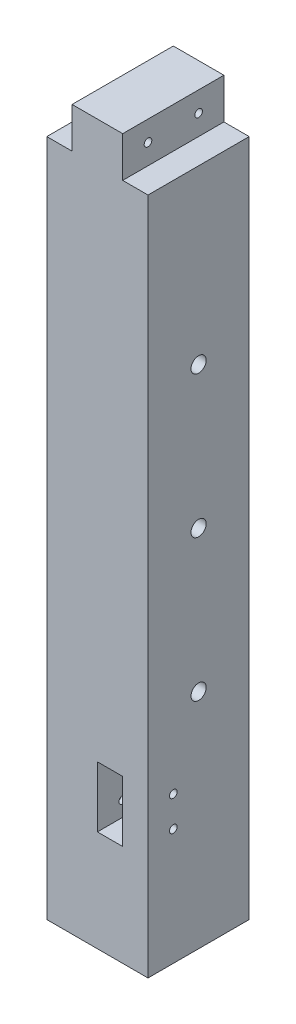
ISO-10303-21;
HEADER;
FILE_DESCRIPTION(('STEP AP214'),'2;1');
FILE_NAME('part.step','',(''),(''),'','','');
FILE_SCHEMA(('AUTOMOTIVE_DESIGN { 1 0 10303 214 1 1 1 1 }'));
ENDSEC;
DATA;
#1=APPLICATION_CONTEXT('core data for automotive mechanical design processes');
#2=APPLICATION_PROTOCOL_DEFINITION('international standard','automotive_design',2000,#1);
#3=PRODUCT_CONTEXT('',#1,'mechanical');
#4=PRODUCT('Part','Part','',(#3));
#5=PRODUCT_RELATED_PRODUCT_CATEGORY('part','',(#4));
#6=PRODUCT_DEFINITION_FORMATION('','',#4);
#7=PRODUCT_DEFINITION_CONTEXT('part definition',#1,'design');
#8=PRODUCT_DEFINITION('design','',#6,#7);
#9=PRODUCT_DEFINITION_SHAPE('','',#8);
#10=(LENGTH_UNIT() NAMED_UNIT(*) SI_UNIT(.MILLI.,.METRE.));
#11=(NAMED_UNIT(*) PLANE_ANGLE_UNIT() SI_UNIT($,.RADIAN.));
#12=(NAMED_UNIT(*) SI_UNIT($,.STERADIAN.) SOLID_ANGLE_UNIT());
#13=UNCERTAINTY_MEASURE_WITH_UNIT(LENGTH_MEASURE(1.E-05),#10,'distance_accuracy_value','');
#14=(GEOMETRIC_REPRESENTATION_CONTEXT(3) GLOBAL_UNCERTAINTY_ASSIGNED_CONTEXT((#13)) GLOBAL_UNIT_ASSIGNED_CONTEXT((#10,
#11,#12)) REPRESENTATION_CONTEXT('',''));
#15=CARTESIAN_POINT('',(0.,0.,0.));
#16=DIRECTION('',(0.,0.,1.));
#17=DIRECTION('',(1.,0.,0.));
#18=AXIS2_PLACEMENT_3D('',#15,#16,#17);
#19=CARTESIAN_POINT('',(-1.85962356624714E-13,425.45,127.));
#20=DIRECTION('',(0.,-1.,0.));
#21=DIRECTION('',(1.,0.,0.));
#22=AXIS2_PLACEMENT_3D('',#19,#20,#21);
#23=PLANE('',#22);
#24=DIRECTION('',(-1.,0.,0.));
#25=VECTOR('',#24,1.);
#26=CARTESIAN_POINT('',(-1.85962356624714E-13,425.45,0.));
#27=LINE('',#26,#25);
#28=CARTESIAN_POINT('',(63.5,425.45,0.));
#29=VERTEX_POINT('',#28);
#30=CARTESIAN_POINT('',(31.75,425.45,0.));
#31=VERTEX_POINT('',#30);
#32=EDGE_CURVE('E216',#29,#31,#27,.T.);
#33=ORIENTED_EDGE('',*,*,#32,.T.);
#34=DIRECTION('',(0.,0.,-1.));
#35=VECTOR('',#34,1.);
#36=CARTESIAN_POINT('',(31.75,425.45,127.));
#37=LINE('',#36,#35);
#38=CARTESIAN_POINT('',(31.75,425.45,127.));
#39=VERTEX_POINT('',#38);
#40=EDGE_CURVE('E11',#39,#31,#37,.T.);
#41=ORIENTED_EDGE('',*,*,#40,.F.);
#42=DIRECTION('',(-1.,0.,0.));
#43=VECTOR('',#42,1.);
#44=CARTESIAN_POINT('',(-1.85962356624714E-13,425.45,127.));
#45=LINE('',#44,#43);
#46=CARTESIAN_POINT('',(63.5,425.45,127.));
#47=VERTEX_POINT('',#46);
#48=EDGE_CURVE('E222',#47,#39,#45,.T.);
#49=ORIENTED_EDGE('',*,*,#48,.F.);
#50=DIRECTION('',(0.,0.,-1.));
#51=VECTOR('',#50,1.);
#52=CARTESIAN_POINT('',(63.5,425.45,127.));
#53=LINE('',#52,#51);
#54=EDGE_CURVE('E241',#47,#29,#53,.T.);
#55=ORIENTED_EDGE('',*,*,#54,.T.);
#56=EDGE_LOOP('',(#33,#41,#49,#55));
#57=FACE_BOUND('',#56,.T.);
#58=ADVANCED_FACE('F35',(#57),#23,.F.);
#59=CARTESIAN_POINT('',(31.7500000000001,0.,127.));
#60=DIRECTION('',(1.,0.,0.));
#61=DIRECTION('',(0.,1.,0.));
#62=AXIS2_PLACEMENT_3D('',#59,#60,#61);
#63=PLANE('',#62);
#64=CARTESIAN_POINT('',(31.75,450.85,31.75));
#65=DIRECTION('',(1.,0.,0.));
#66=DIRECTION('',(0.,1.,0.));
#67=AXIS2_PLACEMENT_3D('',#64,#65,#66);
#68=CIRCLE('',#67,4.7625);
#69=CARTESIAN_POINT('',(31.75,455.6125,31.75));
#70=VERTEX_POINT('',#69);
#71=EDGE_CURVE('E307',#70,#70,#68,.T.);
#72=ORIENTED_EDGE('',*,*,#71,.F.);
#73=EDGE_LOOP('',(#72));
#74=FACE_BOUND('',#73,.T.);
#75=CARTESIAN_POINT('',(31.75,450.85,95.25));
#76=DIRECTION('',(1.,0.,0.));
#77=DIRECTION('',(0.,1.,0.));
#78=AXIS2_PLACEMENT_3D('',#75,#76,#77);
#79=CIRCLE('',#78,4.7625);
#80=CARTESIAN_POINT('',(31.75,455.6125,95.25));
#81=VERTEX_POINT('',#80);
#82=EDGE_CURVE('E297',#81,#81,#79,.T.);
#83=ORIENTED_EDGE('',*,*,#82,.F.);
#84=EDGE_LOOP('',(#83));
#85=FACE_BOUND('',#84,.T.);
#86=DIRECTION('',(0.,-1.,0.));
#87=VECTOR('',#86,1.);
#88=CARTESIAN_POINT('',(31.7500000000001,0.,0.));
#89=LINE('',#88,#87);
#90=CARTESIAN_POINT('',(31.75,476.25,0.));
#91=VERTEX_POINT('',#90);
#92=EDGE_CURVE('E244',#91,#31,#89,.T.);
#93=ORIENTED_EDGE('',*,*,#92,.F.);
#94=DIRECTION('',(0.,0.,-1.));
#95=VECTOR('',#94,1.);
#96=CARTESIAN_POINT('',(31.75,476.25,127.));
#97=LINE('',#96,#95);
#98=CARTESIAN_POINT('',(31.75,476.25,127.));
#99=VERTEX_POINT('',#98);
#100=EDGE_CURVE('E44',#99,#91,#97,.T.);
#101=ORIENTED_EDGE('',*,*,#100,.F.);
#102=DIRECTION('',(0.,-1.,0.));
#103=VECTOR('',#102,1.);
#104=CARTESIAN_POINT('',(31.7500000000001,0.,127.));
#105=LINE('',#104,#103);
#106=EDGE_CURVE('E224',#99,#39,#105,.T.);
#107=ORIENTED_EDGE('',*,*,#106,.T.);
#108=ORIENTED_EDGE('',*,*,#40,.T.);
#109=EDGE_LOOP('',(#93,#101,#107,#108));
#110=FACE_BOUND('',#109,.T.);
#111=ADVANCED_FACE('F37',(#74,#85,#110),#63,.T.);
#112=CARTESIAN_POINT('',(0.,476.25,127.));
#113=DIRECTION('',(0.,-1.,0.));
#114=DIRECTION('',(0.,0.,-1.));
#115=AXIS2_PLACEMENT_3D('',#112,#113,#114);
#116=PLANE('',#115);
#117=DIRECTION('',(-1.,0.,0.));
#118=VECTOR('',#117,1.);
#119=CARTESIAN_POINT('',(0.,476.25,0.));
#120=LINE('',#119,#118);
#121=CARTESIAN_POINT('',(-31.75,476.25,0.));
#122=VERTEX_POINT('',#121);
#123=EDGE_CURVE('E248',#91,#122,#120,.T.);
#124=ORIENTED_EDGE('',*,*,#123,.T.);
#125=DIRECTION('',(0.,0.,-1.));
#126=VECTOR('',#125,1.);
#127=CARTESIAN_POINT('',(-31.75,476.25,127.));
#128=LINE('',#127,#126);
#129=CARTESIAN_POINT('',(-31.75,476.25,127.));
#130=VERTEX_POINT('',#129);
#131=EDGE_CURVE('E271',#130,#122,#128,.T.);
#132=ORIENTED_EDGE('',*,*,#131,.F.);
#133=DIRECTION('',(-1.,0.,0.));
#134=VECTOR('',#133,1.);
#135=CARTESIAN_POINT('',(0.,476.25,127.));
#136=LINE('',#135,#134);
#137=EDGE_CURVE('E229',#99,#130,#136,.T.);
#138=ORIENTED_EDGE('',*,*,#137,.F.);
#139=ORIENTED_EDGE('',*,*,#100,.T.);
#140=EDGE_LOOP('',(#124,#132,#138,#139));
#141=FACE_BOUND('',#140,.T.);
#142=ADVANCED_FACE('F390',(#141),#116,.F.);
#143=CARTESIAN_POINT('',(-31.7499999999999,0.,127.));
#144=DIRECTION('',(1.,0.,0.));
#145=DIRECTION('',(0.,1.,0.));
#146=AXIS2_PLACEMENT_3D('',#143,#144,#145);
#147=PLANE('',#146);
#148=CARTESIAN_POINT('',(-31.75,450.85,31.75));
#149=DIRECTION('',(1.,0.,0.));
#150=DIRECTION('',(0.,1.,0.));
#151=AXIS2_PLACEMENT_3D('',#148,#149,#150);
#152=CIRCLE('',#151,4.7625);
#153=CARTESIAN_POINT('',(-31.75,455.6125,31.75));
#154=VERTEX_POINT('',#153);
#155=EDGE_CURVE('E39',#154,#154,#152,.T.);
#156=ORIENTED_EDGE('',*,*,#155,.T.);
#157=EDGE_LOOP('',(#156));
#158=FACE_BOUND('',#157,.T.);
#159=CARTESIAN_POINT('',(-31.75,450.85,95.25));
#160=DIRECTION('',(1.,0.,0.));
#161=DIRECTION('',(0.,1.,0.));
#162=AXIS2_PLACEMENT_3D('',#159,#160,#161);
#163=CIRCLE('',#162,4.7625);
#164=CARTESIAN_POINT('',(-31.75,455.6125,95.25));
#165=VERTEX_POINT('',#164);
#166=EDGE_CURVE('E294',#165,#165,#163,.T.);
#167=ORIENTED_EDGE('',*,*,#166,.T.);
#168=EDGE_LOOP('',(#167));
#169=FACE_BOUND('',#168,.T.);
#170=DIRECTION('',(0.,-1.,0.));
#171=VECTOR('',#170,1.);
#172=CARTESIAN_POINT('',(-31.7499999999999,0.,0.));
#173=LINE('',#172,#171);
#174=CARTESIAN_POINT('',(-31.75,425.45,0.));
#175=VERTEX_POINT('',#174);
#176=EDGE_CURVE('E250',#122,#175,#173,.T.);
#177=ORIENTED_EDGE('',*,*,#176,.T.);
#178=DIRECTION('',(0.,0.,-1.));
#179=VECTOR('',#178,1.);
#180=CARTESIAN_POINT('',(-31.75,425.45,127.));
#181=LINE('',#180,#179);
#182=CARTESIAN_POINT('',(-31.75,425.45,127.));
#183=VERTEX_POINT('',#182);
#184=EDGE_CURVE('E268',#183,#175,#181,.T.);
#185=ORIENTED_EDGE('',*,*,#184,.F.);
#186=DIRECTION('',(0.,-1.,0.));
#187=VECTOR('',#186,1.);
#188=CARTESIAN_POINT('',(-31.7499999999999,0.,127.));
#189=LINE('',#188,#187);
#190=EDGE_CURVE('E231',#130,#183,#189,.T.);
#191=ORIENTED_EDGE('',*,*,#190,.F.);
#192=ORIENTED_EDGE('',*,*,#131,.T.);
#193=EDGE_LOOP('',(#177,#185,#191,#192));
#194=FACE_BOUND('',#193,.T.);
#195=ADVANCED_FACE('F395',(#158,#169,#194),#147,.F.);
#196=CARTESIAN_POINT('',(-63.5,425.45,0.));
#197=VERTEX_POINT('',#196);
#198=EDGE_CURVE('E245',#175,#197,#27,.T.);
#199=ORIENTED_EDGE('',*,*,#198,.T.);
#200=DIRECTION('',(0.,0.,-1.));
#201=VECTOR('',#200,1.);
#202=CARTESIAN_POINT('',(-63.5,425.45,127.));
#203=LINE('',#202,#201);
#204=CARTESIAN_POINT('',(-63.5,425.45,127.));
#205=VERTEX_POINT('',#204);
#206=EDGE_CURVE('E265',#205,#197,#203,.T.);
#207=ORIENTED_EDGE('',*,*,#206,.F.);
#208=EDGE_CURVE('E226',#183,#205,#45,.T.);
#209=ORIENTED_EDGE('',*,*,#208,.F.);
#210=ORIENTED_EDGE('',*,*,#184,.T.);
#211=EDGE_LOOP('',(#199,#207,#209,#210));
#212=FACE_BOUND('',#211,.T.);
#213=ADVANCED_FACE('F358',(#212),#23,.F.);
#214=CARTESIAN_POINT('',(-63.4999999999998,0.,127.));
#215=DIRECTION('',(1.,0.,0.));
#216=DIRECTION('',(0.,1.,0.));
#217=AXIS2_PLACEMENT_3D('',#214,#215,#216);
#218=PLANE('',#217);
#219=CARTESIAN_POINT('',(-63.4999999999998,31.7499999999999,63.5));
#220=DIRECTION('',(-1.,0.,0.));
#221=DIRECTION('',(0.,-1.,0.));
#222=AXIS2_PLACEMENT_3D('',#219,#220,#221);
#223=CIRCLE('',#222,9.52500000000001);
#224=CARTESIAN_POINT('',(-63.4999999999998,22.2249999999999,63.5));
#225=VERTEX_POINT('',#224);
#226=EDGE_CURVE('E339',#225,#225,#223,.T.);
#227=ORIENTED_EDGE('',*,*,#226,.F.);
#228=EDGE_LOOP('',(#227));
#229=FACE_BOUND('',#228,.T.);
#230=CARTESIAN_POINT('',(-63.4999999999999,209.55,63.5));
#231=DIRECTION('',(-1.,0.,0.));
#232=DIRECTION('',(0.,-1.,0.));
#233=AXIS2_PLACEMENT_3D('',#230,#231,#232);
#234=CIRCLE('',#233,9.525);
#235=CARTESIAN_POINT('',(-63.4999999999999,200.025,63.5));
#236=VERTEX_POINT('',#235);
#237=EDGE_CURVE('E335',#236,#236,#234,.T.);
#238=ORIENTED_EDGE('',*,*,#237,.F.);
#239=EDGE_LOOP('',(#238));
#240=FACE_BOUND('',#239,.T.);
#241=CARTESIAN_POINT('',(-63.4999999999998,-146.05,63.5000000000001));
#242=DIRECTION('',(-1.,0.,0.));
#243=DIRECTION('',(0.,-1.,0.));
#244=AXIS2_PLACEMENT_3D('',#241,#242,#243);
#245=CIRCLE('',#244,9.525);
#246=CARTESIAN_POINT('',(-63.4999999999998,-155.575,63.5000000000001));
#247=VERTEX_POINT('',#246);
#248=EDGE_CURVE('E175',#247,#247,#245,.T.);
#249=ORIENTED_EDGE('',*,*,#248,.F.);
#250=EDGE_LOOP('',(#249));
#251=FACE_BOUND('',#250,.T.);
#252=DIRECTION('',(0.,0.,1.));
#253=VECTOR('',#252,1.);
#254=CARTESIAN_POINT('',(-63.4999999999997,-298.45,63.5));
#255=LINE('',#254,#253);
#256=CARTESIAN_POINT('',(-63.4999999999997,-298.45,31.75));
#257=VERTEX_POINT('',#256);
#258=CARTESIAN_POINT('',(-63.4999999999997,-298.45,63.5));
#259=VERTEX_POINT('',#258);
#260=EDGE_CURVE('E181',#257,#259,#255,.T.);
#261=ORIENTED_EDGE('',*,*,#260,.F.);
#262=DIRECTION('',(0.,-1.,0.));
#263=VECTOR('',#262,1.);
#264=CARTESIAN_POINT('',(-63.4999999999997,-222.25,31.75));
#265=LINE('',#264,#263);
#266=CARTESIAN_POINT('',(-63.4999999999997,-222.25,31.75));
#267=VERTEX_POINT('',#266);
#268=EDGE_CURVE('E52',#267,#257,#265,.T.);
#269=ORIENTED_EDGE('',*,*,#268,.F.);
#270=DIRECTION('',(0.,0.,-1.));
#271=VECTOR('',#270,1.);
#272=CARTESIAN_POINT('',(-63.4999999999997,-222.25,63.5));
#273=LINE('',#272,#271);
#274=CARTESIAN_POINT('',(-63.4999999999997,-222.25,63.5));
#275=VERTEX_POINT('',#274);
#276=EDGE_CURVE('E169',#275,#267,#273,.T.);
#277=ORIENTED_EDGE('',*,*,#276,.F.);
#278=DIRECTION('',(0.,1.,0.));
#279=VECTOR('',#278,1.);
#280=CARTESIAN_POINT('',(-63.4999999999997,-222.25,63.5));
#281=LINE('',#280,#279);
#282=EDGE_CURVE('E172',#259,#275,#281,.T.);
#283=ORIENTED_EDGE('',*,*,#282,.F.);
#284=EDGE_LOOP('',(#261,#269,#277,#283));
#285=FACE_BOUND('',#284,.T.);
#286=DIRECTION('',(0.,-1.,0.));
#287=VECTOR('',#286,1.);
#288=CARTESIAN_POINT('',(-63.4999999999998,0.,0.));
#289=LINE('',#288,#287);
#290=CARTESIAN_POINT('',(-63.4999999999996,-425.45,0.));
#291=VERTEX_POINT('',#290);
#292=EDGE_CURVE('E252',#197,#291,#289,.T.);
#293=ORIENTED_EDGE('',*,*,#292,.T.);
#294=DIRECTION('',(0.,0.,-1.));
#295=VECTOR('',#294,1.);
#296=CARTESIAN_POINT('',(-63.4999999999996,-425.45,127.));
#297=LINE('',#296,#295);
#298=CARTESIAN_POINT('',(-63.4999999999996,-425.45,127.));
#299=VERTEX_POINT('',#298);
#300=EDGE_CURVE('E263',#299,#291,#297,.T.);
#301=ORIENTED_EDGE('',*,*,#300,.F.);
#302=DIRECTION('',(0.,-1.,0.));
#303=VECTOR('',#302,1.);
#304=CARTESIAN_POINT('',(-63.4999999999998,0.,127.));
#305=LINE('',#304,#303);
#306=EDGE_CURVE('E233',#205,#299,#305,.T.);
#307=ORIENTED_EDGE('',*,*,#306,.F.);
#308=ORIENTED_EDGE('',*,*,#206,.T.);
#309=EDGE_LOOP('',(#293,#301,#307,#308));
#310=FACE_BOUND('',#309,.T.);
#311=ADVANCED_FACE('F354',(#229,#240,#251,#285,#310),#218,.F.);
#312=CARTESIAN_POINT('',(1.85962356624714E-13,-425.45,127.));
#313=DIRECTION('',(0.,-1.,0.));
#314=DIRECTION('',(1.,0.,0.));
#315=AXIS2_PLACEMENT_3D('',#312,#313,#314);
#316=PLANE('',#315);
#317=DIRECTION('',(-1.,0.,0.));
#318=VECTOR('',#317,1.);
#319=CARTESIAN_POINT('',(1.85962356624714E-13,-425.45,0.));
#320=LINE('',#319,#318);
#321=CARTESIAN_POINT('',(63.5000000000001,-425.45,0.));
#322=VERTEX_POINT('',#321);
#323=EDGE_CURVE('E255',#322,#291,#320,.T.);
#324=ORIENTED_EDGE('',*,*,#323,.F.);
#325=DIRECTION('',(0.,0.,-1.));
#326=VECTOR('',#325,1.);
#327=CARTESIAN_POINT('',(63.5000000000001,-425.45,127.));
#328=LINE('',#327,#326);
#329=CARTESIAN_POINT('',(63.5000000000001,-425.45,127.));
#330=VERTEX_POINT('',#329);
#331=EDGE_CURVE('E261',#330,#322,#328,.T.);
#332=ORIENTED_EDGE('',*,*,#331,.F.);
#333=DIRECTION('',(-1.,0.,0.));
#334=VECTOR('',#333,1.);
#335=CARTESIAN_POINT('',(1.85962356624714E-13,-425.45,127.));
#336=LINE('',#335,#334);
#337=EDGE_CURVE('E235',#330,#299,#336,.T.);
#338=ORIENTED_EDGE('',*,*,#337,.T.);
#339=ORIENTED_EDGE('',*,*,#300,.T.);
#340=EDGE_LOOP('',(#324,#332,#338,#339));
#341=FACE_BOUND('',#340,.T.);
#342=ADVANCED_FACE('F357',(#341),#316,.T.);
#343=CARTESIAN_POINT('',(63.5,0.,127.));
#344=DIRECTION('',(1.,0.,0.));
#345=DIRECTION('',(0.,1.,0.));
#346=AXIS2_PLACEMENT_3D('',#343,#344,#345);
#347=PLANE('',#346);
#348=CARTESIAN_POINT('',(63.5000000000001,-279.4,95.25));
#349=DIRECTION('',(1.,0.,0.));
#350=DIRECTION('',(0.,1.,0.));
#351=AXIS2_PLACEMENT_3D('',#348,#349,#350);
#352=CIRCLE('',#351,4.7625);
#353=CARTESIAN_POINT('',(63.5000000000001,-274.6375,95.25));
#354=VERTEX_POINT('',#353);
#355=EDGE_CURVE('E296',#354,#354,#352,.T.);
#356=ORIENTED_EDGE('',*,*,#355,.F.);
#357=EDGE_LOOP('',(#356));
#358=FACE_BOUND('',#357,.T.);
#359=CARTESIAN_POINT('',(63.5000000000001,-241.3,95.25));
#360=DIRECTION('',(1.,0.,0.));
#361=DIRECTION('',(0.,1.,0.));
#362=AXIS2_PLACEMENT_3D('',#359,#360,#361);
#363=CIRCLE('',#362,4.7625);
#364=CARTESIAN_POINT('',(63.5000000000001,-236.5375,95.25));
#365=VERTEX_POINT('',#364);
#366=EDGE_CURVE('E314',#365,#365,#363,.T.);
#367=ORIENTED_EDGE('',*,*,#366,.F.);
#368=EDGE_LOOP('',(#367));
#369=FACE_BOUND('',#368,.T.);
#370=CARTESIAN_POINT('',(63.5000000000003,31.75,63.5));
#371=DIRECTION('',(-1.,0.,0.));
#372=DIRECTION('',(0.,-1.,0.));
#373=AXIS2_PLACEMENT_3D('',#370,#371,#372);
#374=CIRCLE('',#373,9.52500000000001);
#375=CARTESIAN_POINT('',(63.5000000000003,22.2249999999999,63.5));
#376=VERTEX_POINT('',#375);
#377=EDGE_CURVE('E336',#376,#376,#374,.T.);
#378=ORIENTED_EDGE('',*,*,#377,.T.);
#379=EDGE_LOOP('',(#378));
#380=FACE_BOUND('',#379,.T.);
#381=CARTESIAN_POINT('',(63.5000000000002,209.55,63.5));
#382=DIRECTION('',(-1.,0.,0.));
#383=DIRECTION('',(0.,-1.,0.));
#384=AXIS2_PLACEMENT_3D('',#381,#382,#383);
#385=CIRCLE('',#384,9.525);
#386=CARTESIAN_POINT('',(63.5000000000002,200.025,63.5));
#387=VERTEX_POINT('',#386);
#388=EDGE_CURVE('E342',#387,#387,#385,.T.);
#389=ORIENTED_EDGE('',*,*,#388,.T.);
#390=EDGE_LOOP('',(#389));
#391=FACE_BOUND('',#390,.T.);
#392=CARTESIAN_POINT('',(63.5000000000004,-146.05,63.5000000000001));
#393=DIRECTION('',(-1.,0.,0.));
#394=DIRECTION('',(0.,-1.,0.));
#395=AXIS2_PLACEMENT_3D('',#392,#393,#394);
#396=CIRCLE('',#395,9.525);
#397=CARTESIAN_POINT('',(63.5000000000004,-155.575,63.5000000000001));
#398=VERTEX_POINT('',#397);
#399=EDGE_CURVE('E182',#398,#398,#396,.T.);
#400=ORIENTED_EDGE('',*,*,#399,.T.);
#401=EDGE_LOOP('',(#400));
#402=FACE_BOUND('',#401,.T.);
#403=DIRECTION('',(0.,-1.,0.));
#404=VECTOR('',#403,1.);
#405=CARTESIAN_POINT('',(63.5,0.,0.));
#406=LINE('',#405,#404);
#407=EDGE_CURVE('E225',#29,#322,#406,.T.);
#408=ORIENTED_EDGE('',*,*,#407,.F.);
#409=ORIENTED_EDGE('',*,*,#54,.F.);
#410=DIRECTION('',(0.,-1.,0.));
#411=VECTOR('',#410,1.);
#412=CARTESIAN_POINT('',(63.5,0.,127.));
#413=LINE('',#412,#411);
#414=EDGE_CURVE('E238',#47,#330,#413,.T.);
#415=ORIENTED_EDGE('',*,*,#414,.T.);
#416=ORIENTED_EDGE('',*,*,#331,.T.);
#417=EDGE_LOOP('',(#408,#409,#415,#416));
#418=FACE_BOUND('',#417,.T.);
#419=ADVANCED_FACE('F379',(#358,#369,#380,#391,#402,#418),#347,.T.);
#420=CARTESIAN_POINT('',(0.,0.,127.));
#421=DIRECTION('',(0.,0.,1.));
#422=DIRECTION('',(1.,0.,0.));
#423=AXIS2_PLACEMENT_3D('',#420,#421,#422);
#424=PLANE('',#423);
#425=DIRECTION('',(0.,-1.,0.));
#426=VECTOR('',#425,1.);
#427=CARTESIAN_POINT('',(0.,-222.25,127.));
#428=LINE('',#427,#426);
#429=CARTESIAN_POINT('',(0.,-222.25,127.));
#430=VERTEX_POINT('',#429);
#431=CARTESIAN_POINT('',(0.,-298.45,127.));
#432=VERTEX_POINT('',#431);
#433=EDGE_CURVE('E60',#430,#432,#428,.T.);
#434=ORIENTED_EDGE('',*,*,#433,.F.);
#435=DIRECTION('',(-1.,0.,0.));
#436=VECTOR('',#435,1.);
#437=CARTESIAN_POINT('',(31.75,-222.25,127.));
#438=LINE('',#437,#436);
#439=CARTESIAN_POINT('',(31.75,-222.25,127.));
#440=VERTEX_POINT('',#439);
#441=EDGE_CURVE('E195',#440,#430,#438,.T.);
#442=ORIENTED_EDGE('',*,*,#441,.F.);
#443=DIRECTION('',(0.,1.,0.));
#444=VECTOR('',#443,1.);
#445=CARTESIAN_POINT('',(31.75,-222.25,127.));
#446=LINE('',#445,#444);
#447=CARTESIAN_POINT('',(31.75,-298.45,127.));
#448=VERTEX_POINT('',#447);
#449=EDGE_CURVE('E209',#448,#440,#446,.T.);
#450=ORIENTED_EDGE('',*,*,#449,.F.);
#451=DIRECTION('',(1.,0.,0.));
#452=VECTOR('',#451,1.);
#453=CARTESIAN_POINT('',(31.75,-298.45,127.));
#454=LINE('',#453,#452);
#455=EDGE_CURVE('E206',#432,#448,#454,.T.);
#456=ORIENTED_EDGE('',*,*,#455,.F.);
#457=EDGE_LOOP('',(#434,#442,#450,#456));
#458=FACE_BOUND('',#457,.T.);
#459=ORIENTED_EDGE('',*,*,#48,.T.);
#460=ORIENTED_EDGE('',*,*,#106,.F.);
#461=ORIENTED_EDGE('',*,*,#137,.T.);
#462=ORIENTED_EDGE('',*,*,#190,.T.);
#463=ORIENTED_EDGE('',*,*,#208,.T.);
#464=ORIENTED_EDGE('',*,*,#306,.T.);
#465=ORIENTED_EDGE('',*,*,#337,.F.);
#466=ORIENTED_EDGE('',*,*,#414,.F.);
#467=EDGE_LOOP('',(#459,#460,#461,#462,#463,#464,#465,#466));
#468=FACE_BOUND('',#467,.T.);
#469=ADVANCED_FACE('F377',(#458,#468),#424,.T.);
#470=CARTESIAN_POINT('',(0.,0.,0.));
#471=DIRECTION('',(0.,0.,1.));
#472=DIRECTION('',(1.,0.,0.));
#473=AXIS2_PLACEMENT_3D('',#470,#471,#472);
#474=PLANE('',#473);
#475=CARTESIAN_POINT('',(-31.7499999999997,-241.3,0.));
#476=DIRECTION('',(0.,0.,-1.));
#477=DIRECTION('',(-1.,0.,0.));
#478=AXIS2_PLACEMENT_3D('',#475,#476,#477);
#479=CIRCLE('',#478,4.7625);
#480=CARTESIAN_POINT('',(-36.5124999999997,-241.3,0.));
#481=VERTEX_POINT('',#480);
#482=EDGE_CURVE('E321',#481,#481,#479,.T.);
#483=ORIENTED_EDGE('',*,*,#482,.F.);
#484=EDGE_LOOP('',(#483));
#485=FACE_BOUND('',#484,.T.);
#486=CARTESIAN_POINT('',(-31.7499999999996,-279.4,0.));
#487=DIRECTION('',(0.,0.,-1.));
#488=DIRECTION('',(-1.,0.,0.));
#489=AXIS2_PLACEMENT_3D('',#486,#487,#488);
#490=CIRCLE('',#489,4.7625);
#491=CARTESIAN_POINT('',(-36.5124999999996,-279.4,0.));
#492=VERTEX_POINT('',#491);
#493=EDGE_CURVE('E328',#492,#492,#490,.T.);
#494=ORIENTED_EDGE('',*,*,#493,.F.);
#495=EDGE_LOOP('',(#494));
#496=FACE_BOUND('',#495,.T.);
#497=ORIENTED_EDGE('',*,*,#32,.F.);
#498=ORIENTED_EDGE('',*,*,#407,.T.);
#499=ORIENTED_EDGE('',*,*,#323,.T.);
#500=ORIENTED_EDGE('',*,*,#292,.F.);
#501=ORIENTED_EDGE('',*,*,#198,.F.);
#502=ORIENTED_EDGE('',*,*,#176,.F.);
#503=ORIENTED_EDGE('',*,*,#123,.F.);
#504=ORIENTED_EDGE('',*,*,#92,.T.);
#505=EDGE_LOOP('',(#497,#498,#499,#500,#501,#502,#503,#504));
#506=FACE_BOUND('',#505,.T.);
#507=ADVANCED_FACE('F371',(#485,#496,#506),#474,.F.);
#508=CARTESIAN_POINT('',(0.,-222.25,63.5));
#509=DIRECTION('',(-1.,0.,0.));
#510=DIRECTION('',(0.,-1.,0.));
#511=AXIS2_PLACEMENT_3D('',#508,#509,#510);
#512=PLANE('',#511);
#513=CARTESIAN_POINT('',(0.,-279.4,95.25));
#514=DIRECTION('',(-1.,0.,0.));
#515=DIRECTION('',(0.,-1.,0.));
#516=AXIS2_PLACEMENT_3D('',#513,#514,#515);
#517=CIRCLE('',#516,4.7625);
#518=CARTESIAN_POINT('',(0.,-284.1625,95.25));
#519=VERTEX_POINT('',#518);
#520=EDGE_CURVE('E292',#519,#519,#517,.T.);
#521=ORIENTED_EDGE('',*,*,#520,.T.);
#522=EDGE_LOOP('',(#521));
#523=FACE_BOUND('',#522,.T.);
#524=CARTESIAN_POINT('',(0.,-241.3,95.25));
#525=DIRECTION('',(-1.,0.,0.));
#526=DIRECTION('',(0.,-1.,0.));
#527=AXIS2_PLACEMENT_3D('',#524,#525,#526);
#528=CIRCLE('',#527,4.7625);
#529=CARTESIAN_POINT('',(0.,-246.0625,95.25));
#530=VERTEX_POINT('',#529);
#531=EDGE_CURVE('E288',#530,#530,#528,.T.);
#532=ORIENTED_EDGE('',*,*,#531,.T.);
#533=EDGE_LOOP('',(#532));
#534=FACE_BOUND('',#533,.T.);
#535=ORIENTED_EDGE('',*,*,#433,.T.);
#536=DIRECTION('',(0.,0.,1.));
#537=VECTOR('',#536,1.);
#538=CARTESIAN_POINT('',(0.,-298.45,63.5));
#539=LINE('',#538,#537);
#540=CARTESIAN_POINT('',(0.,-298.45,63.5));
#541=VERTEX_POINT('',#540);
#542=EDGE_CURVE('E204',#541,#432,#539,.T.);
#543=ORIENTED_EDGE('',*,*,#542,.F.);
#544=DIRECTION('',(0.,-1.,0.));
#545=VECTOR('',#544,1.);
#546=CARTESIAN_POINT('',(0.,-222.25,63.5));
#547=LINE('',#546,#545);
#548=CARTESIAN_POINT('',(0.,-222.25,63.5));
#549=VERTEX_POINT('',#548);
#550=EDGE_CURVE('E191',#549,#541,#547,.T.);
#551=ORIENTED_EDGE('',*,*,#550,.F.);
#552=DIRECTION('',(0.,0.,1.));
#553=VECTOR('',#552,1.);
#554=CARTESIAN_POINT('',(0.,-222.25,63.5));
#555=LINE('',#554,#553);
#556=EDGE_CURVE('E214',#549,#430,#555,.T.);
#557=ORIENTED_EDGE('',*,*,#556,.T.);
#558=EDGE_LOOP('',(#535,#543,#551,#557));
#559=FACE_BOUND('',#558,.T.);
#560=ADVANCED_FACE('F499',(#523,#534,#559),#512,.F.);
#561=CARTESIAN_POINT('',(31.75,-222.25,63.5));
#562=DIRECTION('',(0.,1.,0.));
#563=DIRECTION('',(0.,0.,1.));
#564=AXIS2_PLACEMENT_3D('',#561,#562,#563);
#565=PLANE('',#564);
#566=ORIENTED_EDGE('',*,*,#441,.T.);
#567=ORIENTED_EDGE('',*,*,#556,.F.);
#568=DIRECTION('',(-1.,0.,0.));
#569=VECTOR('',#568,1.);
#570=CARTESIAN_POINT('',(31.75,-222.25,63.5));
#571=LINE('',#570,#569);
#572=CARTESIAN_POINT('',(31.75,-222.25,63.5));
#573=VERTEX_POINT('',#572);
#574=EDGE_CURVE('E201',#573,#549,#571,.T.);
#575=ORIENTED_EDGE('',*,*,#574,.F.);
#576=DIRECTION('',(0.,0.,1.));
#577=VECTOR('',#576,1.);
#578=CARTESIAN_POINT('',(31.75,-222.25,63.5));
#579=LINE('',#578,#577);
#580=EDGE_CURVE('E217',#573,#440,#579,.T.);
#581=ORIENTED_EDGE('',*,*,#580,.T.);
#582=EDGE_LOOP('',(#566,#567,#575,#581));
#583=FACE_BOUND('',#582,.T.);
#584=ADVANCED_FACE('F495',(#583),#565,.F.);
#585=CARTESIAN_POINT('',(31.75,-222.25,63.5));
#586=DIRECTION('',(1.,0.,0.));
#587=DIRECTION('',(0.,1.,0.));
#588=AXIS2_PLACEMENT_3D('',#585,#586,#587);
#589=PLANE('',#588);
#590=CARTESIAN_POINT('',(31.75,-279.4,95.25));
#591=DIRECTION('',(1.,0.,0.));
#592=DIRECTION('',(0.,1.,0.));
#593=AXIS2_PLACEMENT_3D('',#590,#591,#592);
#594=CIRCLE('',#593,4.7625);
#595=CARTESIAN_POINT('',(31.75,-274.6375,95.25));
#596=VERTEX_POINT('',#595);
#597=EDGE_CURVE('E290',#596,#596,#594,.T.);
#598=ORIENTED_EDGE('',*,*,#597,.T.);
#599=EDGE_LOOP('',(#598));
#600=FACE_BOUND('',#599,.T.);
#601=CARTESIAN_POINT('',(31.75,-241.3,95.25));
#602=DIRECTION('',(1.,0.,0.));
#603=DIRECTION('',(0.,1.,0.));
#604=AXIS2_PLACEMENT_3D('',#601,#602,#603);
#605=CIRCLE('',#604,4.7625);
#606=CARTESIAN_POINT('',(31.75,-236.5375,95.25));
#607=VERTEX_POINT('',#606);
#608=EDGE_CURVE('E285',#607,#607,#605,.T.);
#609=ORIENTED_EDGE('',*,*,#608,.T.);
#610=EDGE_LOOP('',(#609));
#611=FACE_BOUND('',#610,.T.);
#612=ORIENTED_EDGE('',*,*,#449,.T.);
#613=ORIENTED_EDGE('',*,*,#580,.F.);
#614=DIRECTION('',(0.,1.,0.));
#615=VECTOR('',#614,1.);
#616=CARTESIAN_POINT('',(31.75,-222.25,63.5));
#617=LINE('',#616,#615);
#618=CARTESIAN_POINT('',(31.75,-298.45,63.5));
#619=VERTEX_POINT('',#618);
#620=EDGE_CURVE('E198',#619,#573,#617,.T.);
#621=ORIENTED_EDGE('',*,*,#620,.F.);
#622=DIRECTION('',(0.,0.,1.));
#623=VECTOR('',#622,1.);
#624=CARTESIAN_POINT('',(31.75,-298.45,63.5));
#625=LINE('',#624,#623);
#626=EDGE_CURVE('E219',#619,#448,#625,.T.);
#627=ORIENTED_EDGE('',*,*,#626,.T.);
#628=EDGE_LOOP('',(#612,#613,#621,#627));
#629=FACE_BOUND('',#628,.T.);
#630=ADVANCED_FACE('F498',(#600,#611,#629),#589,.F.);
#631=CARTESIAN_POINT('',(31.75,-298.45,63.5));
#632=DIRECTION('',(0.,-1.,0.));
#633=DIRECTION('',(0.,0.,-1.));
#634=AXIS2_PLACEMENT_3D('',#631,#632,#633);
#635=PLANE('',#634);
#636=ORIENTED_EDGE('',*,*,#455,.T.);
#637=ORIENTED_EDGE('',*,*,#626,.F.);
#638=DIRECTION('',(1.,0.,0.));
#639=VECTOR('',#638,1.);
#640=CARTESIAN_POINT('',(31.75,-298.45,63.5));
#641=LINE('',#640,#639);
#642=EDGE_CURVE('E194',#541,#619,#641,.T.);
#643=ORIENTED_EDGE('',*,*,#642,.F.);
#644=ORIENTED_EDGE('',*,*,#542,.T.);
#645=EDGE_LOOP('',(#636,#637,#643,#644));
#646=FACE_BOUND('',#645,.T.);
#647=ADVANCED_FACE('F493',(#646),#635,.F.);
#648=CARTESIAN_POINT('',(0.,0.,63.5));
#649=DIRECTION('',(0.,0.,-1.));
#650=DIRECTION('',(-1.,0.,0.));
#651=AXIS2_PLACEMENT_3D('',#648,#649,#650);
#652=PLANE('',#651);
#653=ORIENTED_EDGE('',*,*,#550,.T.);
#654=ORIENTED_EDGE('',*,*,#642,.T.);
#655=ORIENTED_EDGE('',*,*,#620,.T.);
#656=ORIENTED_EDGE('',*,*,#574,.T.);
#657=EDGE_LOOP('',(#653,#654,#655,#656));
#658=FACE_BOUND('',#657,.T.);
#659=ADVANCED_FACE('F489',(#658),#652,.F.);
#660=CARTESIAN_POINT('',(-0.253999999999699,-222.25,31.75));
#661=DIRECTION('',(0.,0.,-1.));
#662=DIRECTION('',(0.,1.,0.));
#663=AXIS2_PLACEMENT_3D('',#660,#661,#662);
#664=PLANE('',#663);
#665=CARTESIAN_POINT('',(-31.7499999999997,-241.3,31.75));
#666=DIRECTION('',(0.,0.,-1.));
#667=DIRECTION('',(0.,1.,0.));
#668=AXIS2_PLACEMENT_3D('',#665,#666,#667);
#669=CIRCLE('',#668,4.7625);
#670=CARTESIAN_POINT('',(-31.7499999999997,-236.5375,31.75));
#671=VERTEX_POINT('',#670);
#672=EDGE_CURVE('E283',#671,#671,#669,.T.);
#673=ORIENTED_EDGE('',*,*,#672,.T.);
#674=EDGE_LOOP('',(#673));
#675=FACE_BOUND('',#674,.T.);
#676=CARTESIAN_POINT('',(-31.7499999999996,-279.4,31.75));
#677=DIRECTION('',(0.,0.,-1.));
#678=DIRECTION('',(0.,1.,0.));
#679=AXIS2_PLACEMENT_3D('',#676,#677,#678);
#680=CIRCLE('',#679,4.7625);
#681=CARTESIAN_POINT('',(-31.7499999999996,-274.6375,31.75));
#682=VERTEX_POINT('',#681);
#683=EDGE_CURVE('E278',#682,#682,#680,.T.);
#684=ORIENTED_EDGE('',*,*,#683,.T.);
#685=EDGE_LOOP('',(#684));
#686=FACE_BOUND('',#685,.T.);
#687=ORIENTED_EDGE('',*,*,#268,.T.);
#688=DIRECTION('',(-1.,0.,0.));
#689=VECTOR('',#688,1.);
#690=CARTESIAN_POINT('',(-0.253999999999671,-298.45,31.75));
#691=LINE('',#690,#689);
#692=CARTESIAN_POINT('',(-0.253999999999671,-298.45,31.75));
#693=VERTEX_POINT('',#692);
#694=EDGE_CURVE('E147',#693,#257,#691,.T.);
#695=ORIENTED_EDGE('',*,*,#694,.F.);
#696=DIRECTION('',(0.,-1.,0.));
#697=VECTOR('',#696,1.);
#698=CARTESIAN_POINT('',(-0.253999999999699,-222.25,31.75));
#699=LINE('',#698,#697);
#700=CARTESIAN_POINT('',(-0.253999999999699,-222.25,31.75));
#701=VERTEX_POINT('',#700);
#702=EDGE_CURVE('E151',#701,#693,#699,.T.);
#703=ORIENTED_EDGE('',*,*,#702,.F.);
#704=DIRECTION('',(-1.,0.,0.));
#705=VECTOR('',#704,1.);
#706=CARTESIAN_POINT('',(-0.253999999999699,-222.25,31.75));
#707=LINE('',#706,#705);
#708=EDGE_CURVE('E186',#701,#267,#707,.T.);
#709=ORIENTED_EDGE('',*,*,#708,.T.);
#710=EDGE_LOOP('',(#687,#695,#703,#709));
#711=FACE_BOUND('',#710,.T.);
#712=ADVANCED_FACE('F149',(#675,#686,#711),#664,.F.);
#713=CARTESIAN_POINT('',(-0.253999999999699,-222.25,63.5));
#714=DIRECTION('',(0.,1.,0.));
#715=DIRECTION('',(-1.,0.,0.));
#716=AXIS2_PLACEMENT_3D('',#713,#714,#715);
#717=PLANE('',#716);
#718=ORIENTED_EDGE('',*,*,#276,.T.);
#719=ORIENTED_EDGE('',*,*,#708,.F.);
#720=DIRECTION('',(0.,0.,-1.));
#721=VECTOR('',#720,1.);
#722=CARTESIAN_POINT('',(-0.253999999999699,-222.25,63.5));
#723=LINE('',#722,#721);
#724=CARTESIAN_POINT('',(-0.253999999999699,-222.25,63.5));
#725=VERTEX_POINT('',#724);
#726=EDGE_CURVE('E157',#725,#701,#723,.T.);
#727=ORIENTED_EDGE('',*,*,#726,.F.);
#728=DIRECTION('',(-1.,0.,0.));
#729=VECTOR('',#728,1.);
#730=CARTESIAN_POINT('',(-0.253999999999699,-222.25,63.5));
#731=LINE('',#730,#729);
#732=EDGE_CURVE('E188',#725,#275,#731,.T.);
#733=ORIENTED_EDGE('',*,*,#732,.T.);
#734=EDGE_LOOP('',(#718,#719,#727,#733));
#735=FACE_BOUND('',#734,.T.);
#736=ADVANCED_FACE('F477',(#735),#717,.F.);
#737=CARTESIAN_POINT('',(-0.253999999999699,-222.25,63.5));
#738=DIRECTION('',(0.,0.,1.));
#739=DIRECTION('',(0.,-1.,0.));
#740=AXIS2_PLACEMENT_3D('',#737,#738,#739);
#741=PLANE('',#740);
#742=CARTESIAN_POINT('',(-31.7499999999997,-241.3,63.5));
#743=DIRECTION('',(0.,0.,1.));
#744=DIRECTION('',(0.,-1.,0.));
#745=AXIS2_PLACEMENT_3D('',#742,#743,#744);
#746=CIRCLE('',#745,4.7625);
#747=CARTESIAN_POINT('',(-31.7499999999997,-246.0625,63.5));
#748=VERTEX_POINT('',#747);
#749=EDGE_CURVE('E280',#748,#748,#746,.T.);
#750=ORIENTED_EDGE('',*,*,#749,.T.);
#751=EDGE_LOOP('',(#750));
#752=FACE_BOUND('',#751,.T.);
#753=CARTESIAN_POINT('',(-31.7499999999996,-279.4,63.5));
#754=DIRECTION('',(0.,0.,1.));
#755=DIRECTION('',(0.,-1.,0.));
#756=AXIS2_PLACEMENT_3D('',#753,#754,#755);
#757=CIRCLE('',#756,4.7625);
#758=CARTESIAN_POINT('',(-31.7499999999996,-284.1625,63.5));
#759=VERTEX_POINT('',#758);
#760=EDGE_CURVE('E275',#759,#759,#757,.T.);
#761=ORIENTED_EDGE('',*,*,#760,.T.);
#762=EDGE_LOOP('',(#761));
#763=FACE_BOUND('',#762,.T.);
#764=ORIENTED_EDGE('',*,*,#282,.T.);
#765=ORIENTED_EDGE('',*,*,#732,.F.);
#766=DIRECTION('',(0.,1.,0.));
#767=VECTOR('',#766,1.);
#768=CARTESIAN_POINT('',(-0.253999999999699,-222.25,63.5));
#769=LINE('',#768,#767);
#770=CARTESIAN_POINT('',(-0.253999999999671,-298.45,63.5));
#771=VERTEX_POINT('',#770);
#772=EDGE_CURVE('E165',#771,#725,#769,.T.);
#773=ORIENTED_EDGE('',*,*,#772,.F.);
#774=DIRECTION('',(-1.,0.,0.));
#775=VECTOR('',#774,1.);
#776=CARTESIAN_POINT('',(-0.253999999999671,-298.45,63.5));
#777=LINE('',#776,#775);
#778=EDGE_CURVE('E156',#771,#259,#777,.T.);
#779=ORIENTED_EDGE('',*,*,#778,.T.);
#780=EDGE_LOOP('',(#764,#765,#773,#779));
#781=FACE_BOUND('',#780,.T.);
#782=ADVANCED_FACE('F480',(#752,#763,#781),#741,.F.);
#783=CARTESIAN_POINT('',(-0.253999999999671,-298.45,63.5));
#784=DIRECTION('',(0.,-1.,0.));
#785=DIRECTION('',(1.,0.,0.));
#786=AXIS2_PLACEMENT_3D('',#783,#784,#785);
#787=PLANE('',#786);
#788=ORIENTED_EDGE('',*,*,#260,.T.);
#789=ORIENTED_EDGE('',*,*,#778,.F.);
#790=DIRECTION('',(0.,0.,1.));
#791=VECTOR('',#790,1.);
#792=CARTESIAN_POINT('',(-0.253999999999671,-298.45,63.5));
#793=LINE('',#792,#791);
#794=EDGE_CURVE('E160',#693,#771,#793,.T.);
#795=ORIENTED_EDGE('',*,*,#794,.F.);
#796=ORIENTED_EDGE('',*,*,#694,.T.);
#797=EDGE_LOOP('',(#788,#789,#795,#796));
#798=FACE_BOUND('',#797,.T.);
#799=ADVANCED_FACE('F161',(#798),#787,.F.);
#800=CARTESIAN_POINT('',(-0.253999999999782,0.,0.));
#801=DIRECTION('',(1.,0.,0.));
#802=DIRECTION('',(0.,1.,0.));
#803=AXIS2_PLACEMENT_3D('',#800,#801,#802);
#804=PLANE('',#803);
#805=ORIENTED_EDGE('',*,*,#702,.T.);
#806=ORIENTED_EDGE('',*,*,#794,.T.);
#807=ORIENTED_EDGE('',*,*,#772,.T.);
#808=ORIENTED_EDGE('',*,*,#726,.T.);
#809=EDGE_LOOP('',(#805,#806,#807,#808));
#810=FACE_BOUND('',#809,.T.);
#811=ADVANCED_FACE('F167',(#810),#804,.F.);
#812=CARTESIAN_POINT('',(63.5000000000004,-146.05,63.5000000000001));
#813=DIRECTION('',(-1.,0.,0.));
#814=DIRECTION('',(0.,-1.,0.));
#815=AXIS2_PLACEMENT_3D('',#812,#813,#814);
#816=CYLINDRICAL_SURFACE('',#815,9.525);
#817=ORIENTED_EDGE('',*,*,#399,.F.);
#818=EDGE_LOOP('',(#817));
#819=FACE_BOUND('',#818,.T.);
#820=ORIENTED_EDGE('',*,*,#248,.T.);
#821=EDGE_LOOP('',(#820));
#822=FACE_BOUND('',#821,.T.);
#823=ADVANCED_FACE('F352',(#819,#822),#816,.F.);
#824=CARTESIAN_POINT('',(63.5000000000002,209.55,63.5));
#825=DIRECTION('',(-1.,0.,0.));
#826=DIRECTION('',(0.,-1.,0.));
#827=AXIS2_PLACEMENT_3D('',#824,#825,#826);
#828=CYLINDRICAL_SURFACE('',#827,9.525);
#829=ORIENTED_EDGE('',*,*,#388,.F.);
#830=EDGE_LOOP('',(#829));
#831=FACE_BOUND('',#830,.T.);
#832=ORIENTED_EDGE('',*,*,#237,.T.);
#833=EDGE_LOOP('',(#832));
#834=FACE_BOUND('',#833,.T.);
#835=ADVANCED_FACE('F467',(#831,#834),#828,.F.);
#836=CARTESIAN_POINT('',(63.5000000000003,31.75,63.5));
#837=DIRECTION('',(-1.,0.,0.));
#838=DIRECTION('',(0.,-1.,0.));
#839=AXIS2_PLACEMENT_3D('',#836,#837,#838);
#840=CYLINDRICAL_SURFACE('',#839,9.52500000000001);
#841=ORIENTED_EDGE('',*,*,#377,.F.);
#842=EDGE_LOOP('',(#841));
#843=FACE_BOUND('',#842,.T.);
#844=ORIENTED_EDGE('',*,*,#226,.T.);
#845=EDGE_LOOP('',(#844));
#846=FACE_BOUND('',#845,.T.);
#847=ADVANCED_FACE('F460',(#843,#846),#840,.F.);
#848=CARTESIAN_POINT('',(0.,0.,69.85));
#849=DIRECTION('',(0.,0.,-1.));
#850=DIRECTION('',(-1.,0.,0.));
#851=AXIS2_PLACEMENT_3D('',#848,#849,#850);
#852=PLANE('',#851);
#853=CARTESIAN_POINT('',(-31.7499999999996,-279.4,69.85));
#854=DIRECTION('',(0.,0.,-1.));
#855=DIRECTION('',(-1.,0.,0.));
#856=AXIS2_PLACEMENT_3D('',#853,#854,#855);
#857=CIRCLE('',#856,4.7625);
#858=CARTESIAN_POINT('',(-36.5124999999996,-279.4,69.85));
#859=VERTEX_POINT('',#858);
#860=EDGE_CURVE('E279',#859,#859,#857,.T.);
#861=ORIENTED_EDGE('',*,*,#860,.T.);
#862=EDGE_LOOP('',(#861));
#863=FACE_BOUND('',#862,.T.);
#864=ADVANCED_FACE('F456',(#863),#852,.T.);
#865=CARTESIAN_POINT('',(-31.7499999999996,-279.4,69.85));
#866=DIRECTION('',(0.,0.,-1.));
#867=DIRECTION('',(-1.,0.,0.));
#868=AXIS2_PLACEMENT_3D('',#865,#866,#867);
#869=CYLINDRICAL_SURFACE('',#868,4.7625);
#870=ORIENTED_EDGE('',*,*,#860,.F.);
#871=EDGE_LOOP('',(#870));
#872=FACE_BOUND('',#871,.T.);
#873=ORIENTED_EDGE('',*,*,#760,.F.);
#874=EDGE_LOOP('',(#873));
#875=FACE_BOUND('',#874,.T.);
#876=ADVANCED_FACE('F459',(#872,#875),#869,.F.);
#877=ORIENTED_EDGE('',*,*,#493,.T.);
#878=EDGE_LOOP('',(#877));
#879=FACE_BOUND('',#878,.T.);
#880=ORIENTED_EDGE('',*,*,#683,.F.);
#881=EDGE_LOOP('',(#880));
#882=FACE_BOUND('',#881,.T.);
#883=ADVANCED_FACE('F450',(#879,#882),#869,.F.);
#884=CARTESIAN_POINT('',(0.,0.,69.85));
#885=DIRECTION('',(0.,0.,-1.));
#886=DIRECTION('',(-1.,0.,0.));
#887=AXIS2_PLACEMENT_3D('',#884,#885,#886);
#888=PLANE('',#887);
#889=CARTESIAN_POINT('',(-31.7499999999997,-241.3,69.85));
#890=DIRECTION('',(0.,0.,-1.));
#891=DIRECTION('',(-1.,0.,0.));
#892=AXIS2_PLACEMENT_3D('',#889,#890,#891);
#893=CIRCLE('',#892,4.7625);
#894=CARTESIAN_POINT('',(-36.5124999999997,-241.3,69.85));
#895=VERTEX_POINT('',#894);
#896=EDGE_CURVE('E284',#895,#895,#893,.T.);
#897=ORIENTED_EDGE('',*,*,#896,.T.);
#898=EDGE_LOOP('',(#897));
#899=FACE_BOUND('',#898,.T.);
#900=ADVANCED_FACE('F446',(#899),#888,.T.);
#901=CARTESIAN_POINT('',(-31.7499999999997,-241.3,69.85));
#902=DIRECTION('',(0.,0.,-1.));
#903=DIRECTION('',(-1.,0.,0.));
#904=AXIS2_PLACEMENT_3D('',#901,#902,#903);
#905=CYLINDRICAL_SURFACE('',#904,4.7625);
#906=ORIENTED_EDGE('',*,*,#896,.F.);
#907=EDGE_LOOP('',(#906));
#908=FACE_BOUND('',#907,.T.);
#909=ORIENTED_EDGE('',*,*,#749,.F.);
#910=EDGE_LOOP('',(#909));
#911=FACE_BOUND('',#910,.T.);
#912=ADVANCED_FACE('F449',(#908,#911),#905,.F.);
#913=ORIENTED_EDGE('',*,*,#482,.T.);
#914=EDGE_LOOP('',(#913));
#915=FACE_BOUND('',#914,.T.);
#916=ORIENTED_EDGE('',*,*,#672,.F.);
#917=EDGE_LOOP('',(#916));
#918=FACE_BOUND('',#917,.T.);
#919=ADVANCED_FACE('F452',(#915,#918),#905,.F.);
#920=CARTESIAN_POINT('',(-6.34999999999991,-241.3,95.25));
#921=DIRECTION('',(1.,0.,0.));
#922=DIRECTION('',(0.,1.,0.));
#923=AXIS2_PLACEMENT_3D('',#920,#921,#922);
#924=CYLINDRICAL_SURFACE('',#923,4.7625);
#925=ORIENTED_EDGE('',*,*,#366,.T.);
#926=EDGE_LOOP('',(#925));
#927=FACE_BOUND('',#926,.T.);
#928=ORIENTED_EDGE('',*,*,#608,.F.);
#929=EDGE_LOOP('',(#928));
#930=FACE_BOUND('',#929,.T.);
#931=ADVANCED_FACE('F444',(#927,#930),#924,.F.);
#932=CARTESIAN_POINT('',(-6.34999999999991,-241.3,95.25));
#933=DIRECTION('',(1.,0.,0.));
#934=DIRECTION('',(0.,1.,0.));
#935=AXIS2_PLACEMENT_3D('',#932,#933,#934);
#936=CIRCLE('',#935,4.7625);
#937=CARTESIAN_POINT('',(-6.34999999999991,-236.5375,95.25));
#938=VERTEX_POINT('',#937);
#939=EDGE_CURVE('E289',#938,#938,#936,.T.);
#940=ORIENTED_EDGE('',*,*,#939,.F.);
#941=EDGE_LOOP('',(#940));
#942=FACE_BOUND('',#941,.T.);
#943=ORIENTED_EDGE('',*,*,#531,.F.);
#944=EDGE_LOOP('',(#943));
#945=FACE_BOUND('',#944,.T.);
#946=ADVANCED_FACE('F440',(#942,#945),#924,.F.);
#947=CARTESIAN_POINT('',(-6.34999999999995,0.,0.));
#948=DIRECTION('',(1.,0.,0.));
#949=DIRECTION('',(0.,1.,0.));
#950=AXIS2_PLACEMENT_3D('',#947,#948,#949);
#951=PLANE('',#950);
#952=ORIENTED_EDGE('',*,*,#939,.T.);
#953=EDGE_LOOP('',(#952));
#954=FACE_BOUND('',#953,.T.);
#955=ADVANCED_FACE('F437',(#954),#951,.T.);
#956=CARTESIAN_POINT('',(-6.34999999999991,-279.4,95.25));
#957=DIRECTION('',(1.,0.,0.));
#958=DIRECTION('',(0.,1.,0.));
#959=AXIS2_PLACEMENT_3D('',#956,#957,#958);
#960=CYLINDRICAL_SURFACE('',#959,4.7625);
#961=ORIENTED_EDGE('',*,*,#355,.T.);
#962=EDGE_LOOP('',(#961));
#963=FACE_BOUND('',#962,.T.);
#964=ORIENTED_EDGE('',*,*,#597,.F.);
#965=EDGE_LOOP('',(#964));
#966=FACE_BOUND('',#965,.T.);
#967=ADVANCED_FACE('F435',(#963,#966),#960,.F.);
#968=CARTESIAN_POINT('',(-6.34999999999991,-279.4,95.25));
#969=DIRECTION('',(1.,0.,0.));
#970=DIRECTION('',(0.,1.,0.));
#971=AXIS2_PLACEMENT_3D('',#968,#969,#970);
#972=CIRCLE('',#971,4.7625);
#973=CARTESIAN_POINT('',(-6.34999999999991,-274.6375,95.25));
#974=VERTEX_POINT('',#973);
#975=EDGE_CURVE('E293',#974,#974,#972,.T.);
#976=ORIENTED_EDGE('',*,*,#975,.F.);
#977=EDGE_LOOP('',(#976));
#978=FACE_BOUND('',#977,.T.);
#979=ORIENTED_EDGE('',*,*,#520,.F.);
#980=EDGE_LOOP('',(#979));
#981=FACE_BOUND('',#980,.T.);
#982=ADVANCED_FACE('F431',(#978,#981),#960,.F.);
#983=CARTESIAN_POINT('',(-6.34999999999995,0.,0.));
#984=DIRECTION('',(1.,0.,0.));
#985=DIRECTION('',(0.,1.,0.));
#986=AXIS2_PLACEMENT_3D('',#983,#984,#985);
#987=PLANE('',#986);
#988=ORIENTED_EDGE('',*,*,#975,.T.);
#989=EDGE_LOOP('',(#988));
#990=FACE_BOUND('',#989,.T.);
#991=ADVANCED_FACE('F426',(#990),#987,.T.);
#992=CARTESIAN_POINT('',(-63.5000000000002,450.85,95.25));
#993=DIRECTION('',(1.,0.,0.));
#994=DIRECTION('',(0.,1.,0.));
#995=AXIS2_PLACEMENT_3D('',#992,#993,#994);
#996=CYLINDRICAL_SURFACE('',#995,4.7625);
#997=CARTESIAN_POINT('',(31.75,455.6125,95.25));
#998=CARTESIAN_POINT('',(31.0885416666667,455.6125,95.25));
#999=CARTESIAN_POINT('',(30.4270833333333,455.6125,95.25));
#1000=CARTESIAN_POINT('',(29.1041666666667,455.6125,95.25));
#1001=CARTESIAN_POINT('',(28.4427083333333,455.6125,95.25));
#1002=CARTESIAN_POINT('',(27.1197916666667,455.6125,95.25));
#1003=CARTESIAN_POINT('',(26.4583333333333,455.6125,95.25));
#1004=CARTESIAN_POINT('',(25.1354166666667,455.6125,95.25));
#1005=CARTESIAN_POINT('',(24.4739583333333,455.6125,95.25));
#1006=CARTESIAN_POINT('',(23.1510416666667,455.6125,95.25));
#1007=CARTESIAN_POINT('',(22.4895833333333,455.6125,95.25));
#1008=CARTESIAN_POINT('',(21.1666666666667,455.6125,95.25));
#1009=CARTESIAN_POINT('',(20.5052083333333,455.6125,95.25));
#1010=CARTESIAN_POINT('',(19.1822916666667,455.6125,95.25));
#1011=CARTESIAN_POINT('',(18.5208333333333,455.6125,95.25));
#1012=CARTESIAN_POINT('',(17.1979166666667,455.6125,95.25));
#1013=CARTESIAN_POINT('',(16.5364583333333,455.6125,95.25));
#1014=CARTESIAN_POINT('',(15.2135416666667,455.6125,95.25));
#1015=CARTESIAN_POINT('',(14.5520833333333,455.6125,95.25));
#1016=CARTESIAN_POINT('',(13.2291666666667,455.6125,95.25));
#1017=CARTESIAN_POINT('',(12.5677083333333,455.6125,95.25));
#1018=CARTESIAN_POINT('',(11.2447916666667,455.6125,95.25));
#1019=CARTESIAN_POINT('',(10.5833333333333,455.6125,95.25));
#1020=CARTESIAN_POINT('',(9.26041666666666,455.6125,95.25));
#1021=CARTESIAN_POINT('',(8.59895833333333,455.6125,95.25));
#1022=CARTESIAN_POINT('',(7.27604166666667,455.6125,95.25));
#1023=CARTESIAN_POINT('',(6.61458333333333,455.6125,95.25));
#1024=CARTESIAN_POINT('',(5.29166666666667,455.6125,95.25));
#1025=CARTESIAN_POINT('',(4.63020833333333,455.6125,95.25));
#1026=CARTESIAN_POINT('',(3.30729166666666,455.6125,95.25));
#1027=CARTESIAN_POINT('',(2.64583333333333,455.6125,95.25));
#1028=CARTESIAN_POINT('',(1.32291666666666,455.6125,95.25));
#1029=CARTESIAN_POINT('',(0.661458333333332,455.6125,95.25));
#1030=CARTESIAN_POINT('',(-0.66145833333333,455.6125,95.25));
#1031=CARTESIAN_POINT('',(-1.32291666666666,455.6125,95.25));
#1032=CARTESIAN_POINT('',(-2.64583333333332,455.6125,95.25));
#1033=CARTESIAN_POINT('',(-3.30729166666666,455.6125,95.25));
#1034=CARTESIAN_POINT('',(-4.63020833333333,455.6125,95.25));
#1035=CARTESIAN_POINT('',(-5.29166666666666,455.6125,95.25));
#1036=CARTESIAN_POINT('',(-6.61458333333333,455.6125,95.25));
#1037=CARTESIAN_POINT('',(-7.27604166666666,455.6125,95.25));
#1038=CARTESIAN_POINT('',(-8.59895833333333,455.6125,95.25));
#1039=CARTESIAN_POINT('',(-9.26041666666666,455.6125,95.25));
#1040=CARTESIAN_POINT('',(-10.5833333333333,455.6125,95.25));
#1041=CARTESIAN_POINT('',(-11.2447916666667,455.6125,95.25));
#1042=CARTESIAN_POINT('',(-12.5677083333333,455.6125,95.25));
#1043=CARTESIAN_POINT('',(-13.2291666666667,455.6125,95.25));
#1044=CARTESIAN_POINT('',(-14.5520833333333,455.6125,95.25));
#1045=CARTESIAN_POINT('',(-15.2135416666667,455.6125,95.25));
#1046=CARTESIAN_POINT('',(-16.5364583333333,455.6125,95.25));
#1047=CARTESIAN_POINT('',(-17.1979166666667,455.6125,95.25));
#1048=CARTESIAN_POINT('',(-18.5208333333333,455.6125,95.25));
#1049=CARTESIAN_POINT('',(-19.1822916666667,455.6125,95.25));
#1050=CARTESIAN_POINT('',(-20.5052083333333,455.6125,95.25));
#1051=CARTESIAN_POINT('',(-21.1666666666667,455.6125,95.25));
#1052=CARTESIAN_POINT('',(-22.4895833333333,455.6125,95.25));
#1053=CARTESIAN_POINT('',(-23.1510416666667,455.6125,95.25));
#1054=CARTESIAN_POINT('',(-24.4739583333333,455.6125,95.25));
#1055=CARTESIAN_POINT('',(-25.1354166666667,455.6125,95.25));
#1056=CARTESIAN_POINT('',(-26.4583333333333,455.6125,95.25));
#1057=CARTESIAN_POINT('',(-27.1197916666667,455.6125,95.25));
#1058=CARTESIAN_POINT('',(-28.4427083333333,455.6125,95.25));
#1059=CARTESIAN_POINT('',(-29.1041666666667,455.6125,95.25));
#1060=CARTESIAN_POINT('',(-30.4270833333333,455.6125,95.25));
#1061=CARTESIAN_POINT('',(-31.0885416666667,455.6125,95.25));
#1062=CARTESIAN_POINT('',(-31.75,455.6125,95.25));
#1063=B_SPLINE_CURVE_WITH_KNOTS('',3,(#997,#998,#999,#1000,#1001,#1002,#1003,#1004,#1005,#1006,
#1007,#1008,#1009,#1010,#1011,#1012,#1013,#1014,#1015,#1016,#1017,#1018,#1019,#1020,#1021,#1022,
#1023,#1024,#1025,#1026,#1027,#1028,#1029,#1030,#1031,#1032,#1033,#1034,#1035,#1036,#1037,#1038,
#1039,#1040,#1041,#1042,#1043,#1044,#1045,#1046,#1047,#1048,#1049,#1050,#1051,#1052,#1053,#1054,
#1055,#1056,#1057,#1058,#1059,#1060,#1061,#1062),.UNSPECIFIED.,.F.,.F.,(4,2,2,2,2,2,2,2,2,2,2,2,
2,2,2,2,2,2,2,2,2,2,2,2,2,2,2,2,2,2,2,2,4),(0.,1.984375,3.96874999999999,5.953125,7.9375,
9.921875,11.90625,13.890625,15.875,17.859375,19.84375,21.828125,23.8125,25.796875,27.78125,
29.765625,31.75,33.734375,35.71875,37.703125,39.6875,41.671875,43.65625,45.640625,47.625,
49.609375,51.59375,53.578125,55.5625,57.546875,59.53125,61.515625,63.5),.UNSPECIFIED.);
#1064=EDGE_CURVE('BSEAM420',#81,#165,#1063,.T.);
#1065=ORIENTED_EDGE('',*,*,#82,.T.);
#1066=ORIENTED_EDGE('',*,*,#166,.F.);
#1067=ORIENTED_EDGE('',*,*,#1064,.T.);
#1068=ORIENTED_EDGE('',*,*,#1064,.F.);
#1069=EDGE_LOOP('',(#1065,#1067,#1066,#1068));
#1070=FACE_BOUND('',#1069,.T.);
#1071=ADVANCED_FACE('F420',(#1070),#996,.F.);
#1072=CARTESIAN_POINT('',(-63.5000000000002,450.85,31.75));
#1073=DIRECTION('',(1.,0.,0.));
#1074=DIRECTION('',(0.,1.,0.));
#1075=AXIS2_PLACEMENT_3D('',#1072,#1073,#1074);
#1076=CYLINDRICAL_SURFACE('',#1075,4.7625);
#1077=CARTESIAN_POINT('',(31.75,455.6125,31.75));
#1078=CARTESIAN_POINT('',(31.0885416666667,455.6125,31.75));
#1079=CARTESIAN_POINT('',(30.4270833333333,455.6125,31.75));
#1080=CARTESIAN_POINT('',(29.1041666666667,455.6125,31.75));
#1081=CARTESIAN_POINT('',(28.4427083333333,455.6125,31.75));
#1082=CARTESIAN_POINT('',(27.1197916666667,455.6125,31.75));
#1083=CARTESIAN_POINT('',(26.4583333333333,455.6125,31.75));
#1084=CARTESIAN_POINT('',(25.1354166666667,455.6125,31.75));
#1085=CARTESIAN_POINT('',(24.4739583333333,455.6125,31.75));
#1086=CARTESIAN_POINT('',(23.1510416666667,455.6125,31.75));
#1087=CARTESIAN_POINT('',(22.4895833333333,455.6125,31.75));
#1088=CARTESIAN_POINT('',(21.1666666666667,455.6125,31.75));
#1089=CARTESIAN_POINT('',(20.5052083333333,455.6125,31.75));
#1090=CARTESIAN_POINT('',(19.1822916666667,455.6125,31.75));
#1091=CARTESIAN_POINT('',(18.5208333333333,455.6125,31.75));
#1092=CARTESIAN_POINT('',(17.1979166666667,455.6125,31.75));
#1093=CARTESIAN_POINT('',(16.5364583333333,455.6125,31.75));
#1094=CARTESIAN_POINT('',(15.2135416666667,455.6125,31.75));
#1095=CARTESIAN_POINT('',(14.5520833333333,455.6125,31.75));
#1096=CARTESIAN_POINT('',(13.2291666666667,455.6125,31.75));
#1097=CARTESIAN_POINT('',(12.5677083333333,455.6125,31.75));
#1098=CARTESIAN_POINT('',(11.2447916666667,455.6125,31.75));
#1099=CARTESIAN_POINT('',(10.5833333333333,455.6125,31.75));
#1100=CARTESIAN_POINT('',(9.26041666666666,455.6125,31.75));
#1101=CARTESIAN_POINT('',(8.59895833333333,455.6125,31.75));
#1102=CARTESIAN_POINT('',(7.27604166666667,455.6125,31.75));
#1103=CARTESIAN_POINT('',(6.61458333333333,455.6125,31.75));
#1104=CARTESIAN_POINT('',(5.29166666666667,455.6125,31.75));
#1105=CARTESIAN_POINT('',(4.63020833333333,455.6125,31.75));
#1106=CARTESIAN_POINT('',(3.30729166666666,455.6125,31.75));
#1107=CARTESIAN_POINT('',(2.64583333333333,455.6125,31.75));
#1108=CARTESIAN_POINT('',(1.32291666666666,455.6125,31.75));
#1109=CARTESIAN_POINT('',(0.661458333333332,455.6125,31.75));
#1110=CARTESIAN_POINT('',(-0.66145833333333,455.6125,31.75));
#1111=CARTESIAN_POINT('',(-1.32291666666666,455.6125,31.75));
#1112=CARTESIAN_POINT('',(-2.64583333333332,455.6125,31.75));
#1113=CARTESIAN_POINT('',(-3.30729166666666,455.6125,31.75));
#1114=CARTESIAN_POINT('',(-4.63020833333333,455.6125,31.75));
#1115=CARTESIAN_POINT('',(-5.29166666666666,455.6125,31.75));
#1116=CARTESIAN_POINT('',(-6.61458333333333,455.6125,31.75));
#1117=CARTESIAN_POINT('',(-7.27604166666666,455.6125,31.75));
#1118=CARTESIAN_POINT('',(-8.59895833333333,455.6125,31.75));
#1119=CARTESIAN_POINT('',(-9.26041666666666,455.6125,31.75));
#1120=CARTESIAN_POINT('',(-10.5833333333333,455.6125,31.75));
#1121=CARTESIAN_POINT('',(-11.2447916666667,455.6125,31.75));
#1122=CARTESIAN_POINT('',(-12.5677083333333,455.6125,31.75));
#1123=CARTESIAN_POINT('',(-13.2291666666667,455.6125,31.75));
#1124=CARTESIAN_POINT('',(-14.5520833333333,455.6125,31.75));
#1125=CARTESIAN_POINT('',(-15.2135416666667,455.6125,31.75));
#1126=CARTESIAN_POINT('',(-16.5364583333333,455.6125,31.75));
#1127=CARTESIAN_POINT('',(-17.1979166666667,455.6125,31.75));
#1128=CARTESIAN_POINT('',(-18.5208333333333,455.6125,31.75));
#1129=CARTESIAN_POINT('',(-19.1822916666667,455.6125,31.75));
#1130=CARTESIAN_POINT('',(-20.5052083333333,455.6125,31.75));
#1131=CARTESIAN_POINT('',(-21.1666666666667,455.6125,31.75));
#1132=CARTESIAN_POINT('',(-22.4895833333333,455.6125,31.75));
#1133=CARTESIAN_POINT('',(-23.1510416666667,455.6125,31.75));
#1134=CARTESIAN_POINT('',(-24.4739583333333,455.6125,31.75));
#1135=CARTESIAN_POINT('',(-25.1354166666667,455.6125,31.75));
#1136=CARTESIAN_POINT('',(-26.4583333333333,455.6125,31.75));
#1137=CARTESIAN_POINT('',(-27.1197916666667,455.6125,31.75));
#1138=CARTESIAN_POINT('',(-28.4427083333333,455.6125,31.75));
#1139=CARTESIAN_POINT('',(-29.1041666666667,455.6125,31.75));
#1140=CARTESIAN_POINT('',(-30.4270833333333,455.6125,31.75));
#1141=CARTESIAN_POINT('',(-31.0885416666667,455.6125,31.75));
#1142=CARTESIAN_POINT('',(-31.75,455.6125,31.75));
#1143=B_SPLINE_CURVE_WITH_KNOTS('',3,(#1077,#1078,#1079,#1080,#1081,#1082,#1083,#1084,#1085,
#1086,#1087,#1088,#1089,#1090,#1091,#1092,#1093,#1094,#1095,#1096,#1097,#1098,#1099,#1100,#1101,
#1102,#1103,#1104,#1105,#1106,#1107,#1108,#1109,#1110,#1111,#1112,#1113,#1114,#1115,#1116,#1117,
#1118,#1119,#1120,#1121,#1122,#1123,#1124,#1125,#1126,#1127,#1128,#1129,#1130,#1131,#1132,#1133,
#1134,#1135,#1136,#1137,#1138,#1139,#1140,#1141,#1142),.UNSPECIFIED.,.F.,.F.,(4,2,2,2,2,2,2,2,2,
2,2,2,2,2,2,2,2,2,2,2,2,2,2,2,2,2,2,2,2,2,2,2,4),(0.,1.984375,3.96874999999999,5.953125,7.9375,
9.921875,11.90625,13.890625,15.875,17.859375,19.84375,21.828125,23.8125,25.796875,27.78125,
29.765625,31.75,33.734375,35.71875,37.703125,39.6875,41.671875,43.65625,45.640625,47.625,
49.609375,51.59375,53.578125,55.5625,57.546875,59.53125,61.515625,63.5),.UNSPECIFIED.);
#1144=EDGE_CURVE('BSEAM417',#70,#154,#1143,.T.);
#1145=ORIENTED_EDGE('',*,*,#71,.T.);
#1146=ORIENTED_EDGE('',*,*,#155,.F.);
#1147=ORIENTED_EDGE('',*,*,#1144,.T.);
#1148=ORIENTED_EDGE('',*,*,#1144,.F.);
#1149=EDGE_LOOP('',(#1145,#1147,#1146,#1148));
#1150=FACE_BOUND('',#1149,.T.);
#1151=ADVANCED_FACE('F417',(#1150),#1076,.F.);
#1152=CLOSED_SHELL('',(#58,#111,#142,#195,#213,#311,#342,#419,#469,#507,#560,#584,#630,#647,
#659,#712,#736,#782,#799,#811,#823,#835,#847,#864,#876,#883,#900,#912,#919,#931,#946,#955,#967,
#982,#991,#1071,#1151));
#1153=MANIFOLD_SOLID_BREP('B2',#1152);
#1154=ADVANCED_BREP_SHAPE_REPRESENTATION('',(#18,#1153),#14);
#1155=SHAPE_DEFINITION_REPRESENTATION(#9,#1154);
ENDSEC;
END-ISO-10303-21;
